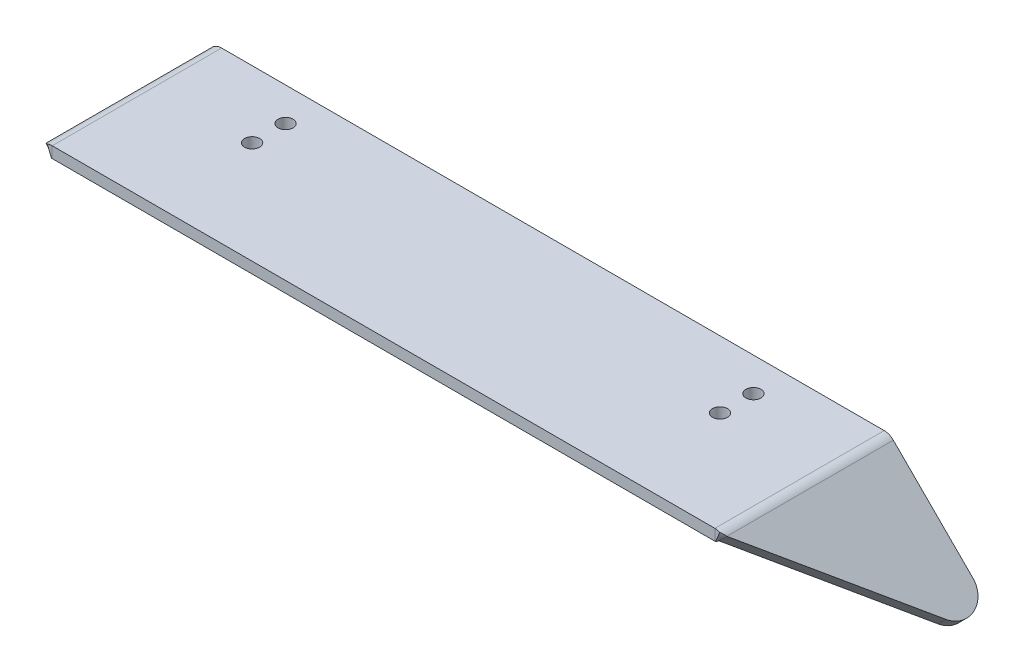
ISO-10303-21;
HEADER;
FILE_DESCRIPTION(('STEP AP214'),'2;1');
FILE_NAME('part.step','',(''),(''),'','','');
FILE_SCHEMA(('AUTOMOTIVE_DESIGN { 1 0 10303 214 1 1 1 1 }'));
ENDSEC;
DATA;
#1=APPLICATION_CONTEXT('core data for automotive mechanical design processes');
#2=APPLICATION_PROTOCOL_DEFINITION('international standard','automotive_design',2000,#1);
#3=PRODUCT_CONTEXT('',#1,'mechanical');
#4=PRODUCT('Part','Part','',(#3));
#5=PRODUCT_RELATED_PRODUCT_CATEGORY('part','',(#4));
#6=PRODUCT_DEFINITION_FORMATION('','',#4);
#7=PRODUCT_DEFINITION_CONTEXT('part definition',#1,'design');
#8=PRODUCT_DEFINITION('design','',#6,#7);
#9=PRODUCT_DEFINITION_SHAPE('','',#8);
#10=(LENGTH_UNIT() NAMED_UNIT(*) SI_UNIT(.MILLI.,.METRE.));
#11=(NAMED_UNIT(*) PLANE_ANGLE_UNIT() SI_UNIT($,.RADIAN.));
#12=(NAMED_UNIT(*) SI_UNIT($,.STERADIAN.) SOLID_ANGLE_UNIT());
#13=UNCERTAINTY_MEASURE_WITH_UNIT(LENGTH_MEASURE(1.E-05),#10,'distance_accuracy_value','');
#14=(GEOMETRIC_REPRESENTATION_CONTEXT(3) GLOBAL_UNCERTAINTY_ASSIGNED_CONTEXT((#13)) GLOBAL_UNIT_ASSIGNED_CONTEXT((#10,
#11,#12)) REPRESENTATION_CONTEXT('',''));
#15=CARTESIAN_POINT('',(0.,0.,0.));
#16=DIRECTION('',(0.,0.,1.));
#17=DIRECTION('',(1.,0.,0.));
#18=AXIS2_PLACEMENT_3D('',#15,#16,#17);
#19=CARTESIAN_POINT('',(-128.179743878931,0.,6.35000000000003));
#20=DIRECTION('',(0.,-1.,0.));
#21=DIRECTION('',(0.,0.,-1.));
#22=AXIS2_PLACEMENT_3D('',#19,#20,#21);
#23=PLANE('',#22);
#24=CARTESIAN_POINT('',(-66.6750000000001,0.,9.52499999999995));
#25=DIRECTION('',(0.,-1.,0.));
#26=DIRECTION('',(0.,0.,-1.));
#27=AXIS2_PLACEMENT_3D('',#24,#25,#26);
#28=CIRCLE('',#27,2.15264999999999);
#29=CARTESIAN_POINT('',(-66.6750000000001,0.,7.37234999999996));
#30=VERTEX_POINT('',#29);
#31=EDGE_CURVE('E588',#30,#30,#28,.T.);
#32=ORIENTED_EDGE('',*,*,#31,.F.);
#33=EDGE_LOOP('',(#32));
#34=FACE_BOUND('',#33,.T.);
#35=CARTESIAN_POINT('',(66.6749999999999,0.,9.52499999999997));
#36=DIRECTION('',(0.,-1.,0.));
#37=DIRECTION('',(0.,0.,-1.));
#38=AXIS2_PLACEMENT_3D('',#35,#36,#37);
#39=CIRCLE('',#38,2.15264999999999);
#40=CARTESIAN_POINT('',(66.6749999999999,0.,7.37234999999998));
#41=VERTEX_POINT('',#40);
#42=EDGE_CURVE('E582',#41,#41,#39,.T.);
#43=ORIENTED_EDGE('',*,*,#42,.F.);
#44=EDGE_LOOP('',(#43));
#45=FACE_BOUND('',#44,.T.);
#46=CARTESIAN_POINT('',(66.675,0.,19.05));
#47=DIRECTION('',(0.,-1.,0.));
#48=DIRECTION('',(0.,0.,-1.));
#49=AXIS2_PLACEMENT_3D('',#46,#47,#48);
#50=CIRCLE('',#49,2.15264999999999);
#51=CARTESIAN_POINT('',(66.675,0.,16.89735));
#52=VERTEX_POINT('',#51);
#53=EDGE_CURVE('E65',#52,#52,#50,.T.);
#54=ORIENTED_EDGE('',*,*,#53,.F.);
#55=EDGE_LOOP('',(#54));
#56=FACE_BOUND('',#55,.T.);
#57=CARTESIAN_POINT('',(-66.675,0.,19.05));
#58=DIRECTION('',(0.,-1.,0.));
#59=DIRECTION('',(0.,0.,-1.));
#60=AXIS2_PLACEMENT_3D('',#57,#58,#59);
#61=CIRCLE('',#60,2.15264999999999);
#62=CARTESIAN_POINT('',(-66.675,0.,16.89735));
#63=VERTEX_POINT('',#62);
#64=EDGE_CURVE('E199',#63,#63,#61,.T.);
#65=ORIENTED_EDGE('',*,*,#64,.F.);
#66=EDGE_LOOP('',(#65));
#67=FACE_BOUND('',#66,.T.);
#68=DIRECTION('',(-1.,0.,0.));
#69=VECTOR('',#68,1.);
#70=CARTESIAN_POINT('',(-128.179743878931,0.,0.));
#71=LINE('',#70,#69);
#72=CARTESIAN_POINT('',(94.4302406669538,0.,0.));
#73=VERTEX_POINT('',#72);
#74=CARTESIAN_POINT('',(-94.4302406669539,0.,0.));
#75=VERTEX_POINT('',#74);
#76=EDGE_CURVE('E78',#73,#75,#71,.T.);
#77=ORIENTED_EDGE('',*,*,#76,.F.);
#78=DIRECTION('',(0.,0.,1.));
#79=VECTOR('',#78,1.);
#80=CARTESIAN_POINT('',(94.4302406669539,0.,6.35000000000003));
#81=LINE('',#80,#79);
#82=CARTESIAN_POINT('',(94.4302406669539,0.,48.26));
#83=VERTEX_POINT('',#82);
#84=EDGE_CURVE('E70',#73,#83,#81,.T.);
#85=ORIENTED_EDGE('',*,*,#84,.T.);
#86=DIRECTION('',(1.,0.,0.));
#87=VECTOR('',#86,1.);
#88=CARTESIAN_POINT('',(95.25,0.,48.26));
#89=LINE('',#88,#87);
#90=CARTESIAN_POINT('',(-94.4302406669539,0.,48.26));
#91=VERTEX_POINT('',#90);
#92=EDGE_CURVE('E86',#91,#83,#89,.T.);
#93=ORIENTED_EDGE('',*,*,#92,.F.);
#94=DIRECTION('',(0.,0.,1.));
#95=VECTOR('',#94,1.);
#96=CARTESIAN_POINT('',(-94.4302406669539,0.,6.35000000000003));
#97=LINE('',#96,#95);
#98=EDGE_CURVE('E471',#75,#91,#97,.T.);
#99=ORIENTED_EDGE('',*,*,#98,.F.);
#100=EDGE_LOOP('',(#77,#85,#93,#99));
#101=FACE_BOUND('',#100,.T.);
#102=ADVANCED_FACE('F61',(#34,#45,#56,#67,#101),#23,.T.);
#103=CARTESIAN_POINT('',(-128.179743878931,3.175,6.35000000000003));
#104=DIRECTION('',(0.,-1.,0.));
#105=DIRECTION('',(0.,0.,-1.));
#106=AXIS2_PLACEMENT_3D('',#103,#104,#105);
#107=PLANE('',#106);
#108=CARTESIAN_POINT('',(-66.6750000000001,3.175,9.52499999999995));
#109=DIRECTION('',(0.,1.,0.));
#110=DIRECTION('',(0.,0.,1.));
#111=AXIS2_PLACEMENT_3D('',#108,#109,#110);
#112=CIRCLE('',#111,2.15264999999999);
#113=CARTESIAN_POINT('',(-66.6750000000001,3.175,11.6776499999999));
#114=VERTEX_POINT('',#113);
#115=EDGE_CURVE('E591',#114,#114,#112,.T.);
#116=ORIENTED_EDGE('',*,*,#115,.F.);
#117=EDGE_LOOP('',(#116));
#118=FACE_BOUND('',#117,.T.);
#119=CARTESIAN_POINT('',(66.6749999999999,3.175,9.52499999999997));
#120=DIRECTION('',(0.,1.,0.));
#121=DIRECTION('',(0.,0.,1.));
#122=AXIS2_PLACEMENT_3D('',#119,#120,#121);
#123=CIRCLE('',#122,2.15264999999999);
#124=CARTESIAN_POINT('',(66.6749999999999,3.175,11.67765));
#125=VERTEX_POINT('',#124);
#126=EDGE_CURVE('E585',#125,#125,#123,.T.);
#127=ORIENTED_EDGE('',*,*,#126,.F.);
#128=EDGE_LOOP('',(#127));
#129=FACE_BOUND('',#128,.T.);
#130=CARTESIAN_POINT('',(66.675,3.175,19.05));
#131=DIRECTION('',(0.,1.,0.));
#132=DIRECTION('',(0.,0.,1.));
#133=AXIS2_PLACEMENT_3D('',#130,#131,#132);
#134=CIRCLE('',#133,2.15264999999999);
#135=CARTESIAN_POINT('',(66.675,3.175,21.20265));
#136=VERTEX_POINT('',#135);
#137=EDGE_CURVE('E578',#136,#136,#134,.T.);
#138=ORIENTED_EDGE('',*,*,#137,.F.);
#139=EDGE_LOOP('',(#138));
#140=FACE_BOUND('',#139,.T.);
#141=CARTESIAN_POINT('',(-66.675,3.175,19.05));
#142=DIRECTION('',(0.,1.,0.));
#143=DIRECTION('',(0.,0.,1.));
#144=AXIS2_PLACEMENT_3D('',#141,#142,#143);
#145=CIRCLE('',#144,2.15264999999999);
#146=CARTESIAN_POINT('',(-66.675,3.175,21.2026499999999));
#147=VERTEX_POINT('',#146);
#148=EDGE_CURVE('E571',#147,#147,#145,.T.);
#149=ORIENTED_EDGE('',*,*,#148,.F.);
#150=EDGE_LOOP('',(#149));
#151=FACE_BOUND('',#150,.T.);
#152=DIRECTION('',(0.,0.,1.));
#153=VECTOR('',#152,1.);
#154=CARTESIAN_POINT('',(94.4302406669539,3.175,6.35000000000003));
#155=LINE('',#154,#153);
#156=CARTESIAN_POINT('',(94.4302406669539,3.175,0.));
#157=VERTEX_POINT('',#156);
#158=CARTESIAN_POINT('',(94.4302406669539,3.175,48.26));
#159=VERTEX_POINT('',#158);
#160=EDGE_CURVE('E333',#157,#159,#155,.T.);
#161=ORIENTED_EDGE('',*,*,#160,.F.);
#162=DIRECTION('',(-1.,0.,0.));
#163=VECTOR('',#162,1.);
#164=CARTESIAN_POINT('',(128.179743878931,3.175,0.));
#165=LINE('',#164,#163);
#166=CARTESIAN_POINT('',(-94.4302406669538,3.175,0.));
#167=VERTEX_POINT('',#166);
#168=EDGE_CURVE('E350',#157,#167,#165,.T.);
#169=ORIENTED_EDGE('',*,*,#168,.T.);
#170=DIRECTION('',(0.,0.,1.));
#171=VECTOR('',#170,1.);
#172=CARTESIAN_POINT('',(-94.4302406669539,3.175,6.35000000000003));
#173=LINE('',#172,#171);
#174=CARTESIAN_POINT('',(-94.4302406669539,3.175,48.26));
#175=VERTEX_POINT('',#174);
#176=EDGE_CURVE('E354',#167,#175,#173,.T.);
#177=ORIENTED_EDGE('',*,*,#176,.T.);
#178=DIRECTION('',(1.,0.,0.));
#179=VECTOR('',#178,1.);
#180=CARTESIAN_POINT('',(95.25,3.175,48.26));
#181=LINE('',#180,#179);
#182=EDGE_CURVE('E348',#175,#159,#181,.T.);
#183=ORIENTED_EDGE('',*,*,#182,.T.);
#184=EDGE_LOOP('',(#161,#169,#177,#183));
#185=FACE_BOUND('',#184,.T.);
#186=ADVANCED_FACE('F387',(#118,#129,#140,#151,#185),#107,.F.);
#187=CARTESIAN_POINT('',(-128.179743878931,3.175,0.));
#188=DIRECTION('',(0.,0.,1.));
#189=DIRECTION('',(1.,0.,0.));
#190=AXIS2_PLACEMENT_3D('',#187,#188,#189);
#191=PLANE('',#190);
#192=DIRECTION('',(0.,1.,0.));
#193=VECTOR('',#192,1.);
#194=CARTESIAN_POINT('',(94.4302406669539,3.175,0.));
#195=LINE('',#194,#193);
#196=EDGE_CURVE('E12',#73,#157,#195,.T.);
#197=ORIENTED_EDGE('',*,*,#196,.F.);
#198=ORIENTED_EDGE('',*,*,#76,.T.);
#199=DIRECTION('',(0.,1.,0.));
#200=VECTOR('',#199,1.);
#201=CARTESIAN_POINT('',(-94.4302406669539,3.175,0.));
#202=LINE('',#201,#200);
#203=EDGE_CURVE('E468',#75,#167,#202,.T.);
#204=ORIENTED_EDGE('',*,*,#203,.T.);
#205=ORIENTED_EDGE('',*,*,#168,.F.);
#206=EDGE_LOOP('',(#197,#198,#204,#205));
#207=FACE_BOUND('',#206,.T.);
#208=ADVANCED_FACE('F63',(#207),#191,.F.);
#209=CARTESIAN_POINT('',(95.25,3.175,48.26));
#210=DIRECTION('',(0.,0.,-1.));
#211=DIRECTION('',(-1.,0.,0.));
#212=AXIS2_PLACEMENT_3D('',#209,#210,#211);
#213=PLANE('',#212);
#214=DIRECTION('',(0.,-1.,0.));
#215=VECTOR('',#214,1.);
#216=CARTESIAN_POINT('',(94.4302406669539,3.175,48.26));
#217=LINE('',#216,#215);
#218=EDGE_CURVE('E341',#159,#83,#217,.T.);
#219=ORIENTED_EDGE('',*,*,#218,.F.);
#220=ORIENTED_EDGE('',*,*,#182,.F.);
#221=DIRECTION('',(0.,-1.,0.));
#222=VECTOR('',#221,1.);
#223=CARTESIAN_POINT('',(-94.4302406669539,3.175,48.26));
#224=LINE('',#223,#222);
#225=EDGE_CURVE('E342',#175,#91,#224,.T.);
#226=ORIENTED_EDGE('',*,*,#225,.T.);
#227=ORIENTED_EDGE('',*,*,#92,.T.);
#228=EDGE_LOOP('',(#219,#220,#226,#227));
#229=FACE_BOUND('',#228,.T.);
#230=ADVANCED_FACE('F397',(#229),#213,.F.);
#231=CARTESIAN_POINT('',(-94.4302406669539,-0.5,0.));
#232=DIRECTION('',(0.,0.,-1.));
#233=DIRECTION('',(-1.,0.,0.));
#234=AXIS2_PLACEMENT_3D('',#231,#232,#233);
#235=PLANE('',#234);
#236=ORIENTED_EDGE('',*,*,#203,.F.);
#237=CARTESIAN_POINT('',(-94.4302406669539,-0.5,0.));
#238=DIRECTION('',(0.,0.,1.));
#239=DIRECTION('',(1.,0.,0.));
#240=AXIS2_PLACEMENT_3D('',#237,#238,#239);
#241=CIRCLE('',#240,0.5);
#242=CARTESIAN_POINT('',(-94.7837940575472,-0.146446609406742,0.));
#243=VERTEX_POINT('',#242);
#244=EDGE_CURVE('E488',#75,#243,#241,.T.);
#245=ORIENTED_EDGE('',*,*,#244,.T.);
#246=DIRECTION('',(-0.707106781186549,0.707106781186546,0.));
#247=VECTOR('',#246,1.);
#248=CARTESIAN_POINT('',(-97.0288580878145,2.09861742086055,0.));
#249=LINE('',#248,#247);
#250=CARTESIAN_POINT('',(-97.0288580878145,2.09861742086059,0.));
#251=VERTEX_POINT('',#250);
#252=EDGE_CURVE('E512',#243,#251,#249,.T.);
#253=ORIENTED_EDGE('',*,*,#252,.T.);
#254=CARTESIAN_POINT('',(-94.4302406669539,-0.5,0.));
#255=DIRECTION('',(0.,0.,1.));
#256=DIRECTION('',(1.,0.,0.));
#257=AXIS2_PLACEMENT_3D('',#254,#255,#256);
#258=CIRCLE('',#257,3.675);
#259=EDGE_CURVE('E515',#167,#251,#258,.T.);
#260=ORIENTED_EDGE('',*,*,#259,.F.);
#261=EDGE_LOOP('',(#236,#245,#253,#260));
#262=FACE_BOUND('',#261,.T.);
#263=ADVANCED_FACE('F400',(#262),#235,.T.);
#264=CARTESIAN_POINT('',(-97.0288580878145,2.09861742086053,47.4402406669539));
#265=CARTESIAN_POINT('',(-96.688541159747,2.43893434892802,47.7136212660517));
#266=CARTESIAN_POINT('',(-96.2812477754291,2.71107908769511,47.9866194009022));
#267=CARTESIAN_POINT('',(-95.8366022808956,2.89525728197897,48.26));
#268=CARTESIAN_POINT('',(-94.7837940575472,-0.146446609406729,47.4402406669539));
#269=CARTESIAN_POINT('',(-94.737512230733,-0.100164782592577,47.7135043833969));
#270=CARTESIAN_POINT('',(-94.6820525039986,-0.0631077779238174,47.986736283557));
#271=CARTESIAN_POINT('',(-94.6215823831365,-0.0380602337443571,48.26));
#272=B_SPLINE_SURFACE_WITH_KNOTS('',1,3,((#264,#265,#266,#267),(#268,#269,#270,#271)),
.UNSPECIFIED.,.F.,.F.,.F.,(2,2),(4,4),(0.,1.),(0.,1.),.UNSPECIFIED.);
#273=CARTESIAN_POINT('',(-97.0288580878145,2.09861742086053,47.4402406669539));
#274=CARTESIAN_POINT('',(-94.7837940575472,-0.146446609406729,47.4402406669539));
#275=B_SPLINE_CURVE_WITH_KNOTS('',1,(#273,#274),.UNSPECIFIED.,.F.,.F.,(2,2),(0.,1.),.UNSPECIFIED.);
#276=CARTESIAN_POINT('',(-97.0288580878145,2.09861742086054,47.4402406669539));
#277=VERTEX_POINT('',#276);
#278=CARTESIAN_POINT('',(-94.7837940575472,-0.146446609406728,47.4402406669539));
#279=VERTEX_POINT('',#278);
#280=EDGE_CURVE('E456',#277,#279,#275,.T.);
#281=CARTESIAN_POINT('',(-94.7837940575472,-0.146446609406729,47.4402406669539));
#282=CARTESIAN_POINT('',(-94.737512230733,-0.100164782592577,47.7135043833969));
#283=CARTESIAN_POINT('',(-94.6820525039986,-0.0631077779238174,47.986736283557));
#284=CARTESIAN_POINT('',(-94.6215823831365,-0.0380602337443571,48.26));
#285=B_SPLINE_CURVE_WITH_KNOTS('',3,(#281,#282,#283,#284),.UNSPECIFIED.,.F.,.F.,(4,4),(0.,1.),.UNSPECIFIED.);
#286=CARTESIAN_POINT('',(-94.6215823831365,-0.0380602337443578,48.26));
#287=VERTEX_POINT('',#286);
#288=EDGE_CURVE('E522',#279,#287,#285,.T.);
#289=CARTESIAN_POINT('',(-94.6215823831365,-0.0380602337443571,48.26));
#290=CARTESIAN_POINT('',(-95.8366022808956,2.89525728197897,48.26));
#291=B_SPLINE_CURVE_WITH_KNOTS('',1,(#289,#290),.UNSPECIFIED.,.F.,.F.,(2,2),(0.,1.),.UNSPECIFIED.);
#292=CARTESIAN_POINT('',(-95.8366022808956,2.89525728197897,48.26));
#293=VERTEX_POINT('',#292);
#294=EDGE_CURVE('E347',#287,#293,#291,.T.);
#295=CARTESIAN_POINT('',(-95.8366022808956,2.89525728197897,48.26));
#296=CARTESIAN_POINT('',(-96.2812477754291,2.71107908769511,47.9866194009022));
#297=CARTESIAN_POINT('',(-96.688541159747,2.43893434892802,47.7136212660517));
#298=CARTESIAN_POINT('',(-97.0288580878145,2.09861742086053,47.4402406669539));
#299=B_SPLINE_CURVE_WITH_KNOTS('',3,(#295,#296,#297,#298),.UNSPECIFIED.,.F.,.F.,(4,4),(0.,1.),.UNSPECIFIED.);
#300=EDGE_CURVE('E518',#277,#293,#299,.F.);
#301=ORIENTED_EDGE('',*,*,#280,.T.);
#302=ORIENTED_EDGE('',*,*,#288,.T.);
#303=ORIENTED_EDGE('',*,*,#294,.T.);
#304=ORIENTED_EDGE('',*,*,#300,.F.);
#305=EDGE_LOOP('',(#301,#302,#303,#304));
#306=FACE_BOUND('',#305,.T.);
#307=ADVANCED_FACE('F403',(#306),#272,.T.);
#308=CARTESIAN_POINT('',(-94.4302406669539,-0.5,48.26));
#309=DIRECTION('',(0.,0.,1.));
#310=DIRECTION('',(1.,0.,0.));
#311=AXIS2_PLACEMENT_3D('',#308,#309,#310);
#312=PLANE('',#311);
#313=ORIENTED_EDGE('',*,*,#294,.F.);
#314=CARTESIAN_POINT('',(-94.4302406669539,-0.5,48.26));
#315=DIRECTION('',(0.,0.,1.));
#316=DIRECTION('',(1.,0.,0.));
#317=AXIS2_PLACEMENT_3D('',#314,#315,#316);
#318=CIRCLE('',#317,0.5);
#319=EDGE_CURVE('E519',#287,#91,#318,.F.);
#320=ORIENTED_EDGE('',*,*,#319,.T.);
#321=ORIENTED_EDGE('',*,*,#225,.F.);
#322=CARTESIAN_POINT('',(-94.4302406669539,-0.5,48.26));
#323=DIRECTION('',(0.,0.,-1.));
#324=DIRECTION('',(-1.,0.,0.));
#325=AXIS2_PLACEMENT_3D('',#322,#323,#324);
#326=CIRCLE('',#325,3.675);
#327=EDGE_CURVE('E529',#293,#175,#326,.T.);
#328=ORIENTED_EDGE('',*,*,#327,.F.);
#329=EDGE_LOOP('',(#313,#320,#321,#328));
#330=FACE_BOUND('',#329,.T.);
#331=ADVANCED_FACE('F410',(#330),#312,.T.);
#332=CARTESIAN_POINT('',(-94.4302406669539,-0.5,-24.2621093408467));
#333=DIRECTION('',(0.,0.,1.));
#334=DIRECTION('',(1.,0.,0.));
#335=AXIS2_PLACEMENT_3D('',#332,#333,#334);
#336=CYLINDRICAL_SURFACE('',#335,3.675);
#337=ORIENTED_EDGE('',*,*,#327,.T.);
#338=ORIENTED_EDGE('',*,*,#176,.F.);
#339=ORIENTED_EDGE('',*,*,#259,.T.);
#340=DIRECTION('',(0.,0.,1.));
#341=VECTOR('',#340,1.);
#342=CARTESIAN_POINT('',(-97.0288580878145,2.09861742086055,6.35000000000003));
#343=LINE('',#342,#341);
#344=EDGE_CURVE('E481',#251,#277,#343,.T.);
#345=ORIENTED_EDGE('',*,*,#344,.T.);
#346=ORIENTED_EDGE('',*,*,#300,.T.);
#347=EDGE_LOOP('',(#337,#338,#339,#345,#346));
#348=FACE_BOUND('',#347,.T.);
#349=ADVANCED_FACE('F324',(#348),#336,.T.);
#350=CARTESIAN_POINT('',(-94.4302406669539,-0.5,-24.2621093408467));
#351=DIRECTION('',(0.,0.,1.));
#352=DIRECTION('',(1.,0.,0.));
#353=AXIS2_PLACEMENT_3D('',#350,#351,#352);
#354=CYLINDRICAL_SURFACE('',#353,0.5);
#355=ORIENTED_EDGE('',*,*,#319,.F.);
#356=ORIENTED_EDGE('',*,*,#288,.F.);
#357=DIRECTION('',(0.,0.,1.));
#358=VECTOR('',#357,1.);
#359=CARTESIAN_POINT('',(-94.7837940575472,-0.146446609406728,6.35000000000003));
#360=LINE('',#359,#358);
#361=EDGE_CURVE('E492',#243,#279,#360,.T.);
#362=ORIENTED_EDGE('',*,*,#361,.F.);
#363=ORIENTED_EDGE('',*,*,#244,.F.);
#364=ORIENTED_EDGE('',*,*,#98,.T.);
#365=EDGE_LOOP('',(#355,#356,#362,#363,#364));
#366=FACE_BOUND('',#365,.T.);
#367=ADVANCED_FACE('F307',(#366),#354,.F.);
#368=CARTESIAN_POINT('',(-119.734045904005,-20.6065703953297,6.35000000000003));
#369=DIRECTION('',(0.707106781186549,-0.707106781186546,0.));
#370=DIRECTION('',(0.,0.,-1.));
#371=AXIS2_PLACEMENT_3D('',#368,#369,#370);
#372=CYLINDRICAL_SURFACE('',#371,6.35000000000003);
#373=CARTESIAN_POINT('',(-117.488981873737,-22.851634425597,6.35000000000003));
#374=DIRECTION('',(-0.707106781186549,0.707106781186546,0.));
#375=DIRECTION('',(0.,0.,-1.));
#376=AXIS2_PLACEMENT_3D('',#373,#374,#375);
#377=CIRCLE('',#376,6.35000000000003);
#378=CARTESIAN_POINT('',(-117.488981873737,-22.851634425597,0.));
#379=VERTEX_POINT('',#378);
#380=CARTESIAN_POINT('',(-120.663981873737,-26.026634425597,10.8401280605346));
#381=VERTEX_POINT('',#380);
#382=EDGE_CURVE('E510',#379,#381,#377,.T.);
#383=ORIENTED_EDGE('',*,*,#382,.T.);
#384=DIRECTION('',(0.707106781186549,-0.707106781186546,0.));
#385=VECTOR('',#384,1.);
#386=CARTESIAN_POINT('',(-122.909045904005,-23.7815703953297,10.8401280605346));
#387=LINE('',#386,#385);
#388=CARTESIAN_POINT('',(-122.909045904005,-23.7815703953297,10.8401280605346));
#389=VERTEX_POINT('',#388);
#390=EDGE_CURVE('E489',#389,#381,#387,.T.);
#391=ORIENTED_EDGE('',*,*,#390,.F.);
#392=CARTESIAN_POINT('',(-119.734045904005,-20.6065703953297,6.35000000000003));
#393=DIRECTION('',(-0.707106781186549,0.707106781186546,0.));
#394=DIRECTION('',(0.,0.,-1.));
#395=AXIS2_PLACEMENT_3D('',#392,#393,#394);
#396=CIRCLE('',#395,6.35000000000003);
#397=CARTESIAN_POINT('',(-119.734045904005,-20.6065703953297,0.));
#398=VERTEX_POINT('',#397);
#399=EDGE_CURVE('E478',#398,#389,#396,.T.);
#400=ORIENTED_EDGE('',*,*,#399,.F.);
#401=DIRECTION('',(0.707106781186549,-0.707106781186546,0.));
#402=VECTOR('',#401,1.);
#403=CARTESIAN_POINT('',(-119.734045904005,-20.6065703953297,0.));
#404=LINE('',#403,#402);
#405=EDGE_CURVE('E508',#398,#379,#404,.T.);
#406=ORIENTED_EDGE('',*,*,#405,.T.);
#407=EDGE_LOOP('',(#383,#391,#400,#406));
#408=FACE_BOUND('',#407,.T.);
#409=ADVANCED_FACE('F303',(#408),#372,.T.);
#410=CARTESIAN_POINT('',(-119.734045904005,-20.6065703953297,6.35000000000003));
#411=DIRECTION('',(0.707106781186549,-0.707106781186546,0.));
#412=DIRECTION('',(0.,0.,-1.));
#413=AXIS2_PLACEMENT_3D('',#410,#411,#412);
#414=PLANE('',#413);
#415=ORIENTED_EDGE('',*,*,#344,.F.);
#416=DIRECTION('',(-0.707106781186546,-0.707106781186549,0.));
#417=VECTOR('',#416,1.);
#418=CARTESIAN_POINT('',(61.5394863110885,160.666961819764,0.));
#419=LINE('',#418,#417);
#420=EDGE_CURVE('E506',#251,#398,#419,.T.);
#421=ORIENTED_EDGE('',*,*,#420,.T.);
#422=ORIENTED_EDGE('',*,*,#399,.T.);
#423=DIRECTION('',(0.499999999999999,0.5,0.707106781186549));
#424=VECTOR('',#423,1.);
#425=CARTESIAN_POINT('',(-96.4492007044766,2.67827480419841,48.26));
#426=LINE('',#425,#424);
#427=EDGE_CURVE('E474',#389,#277,#426,.T.);
#428=ORIENTED_EDGE('',*,*,#427,.T.);
#429=EDGE_LOOP('',(#415,#421,#422,#428));
#430=FACE_BOUND('',#429,.T.);
#431=ADVANCED_FACE('F306',(#430),#414,.F.);
#432=CARTESIAN_POINT('',(-119.734045904005,-20.6065703953297,0.));
#433=DIRECTION('',(0.,0.,1.));
#434=DIRECTION('',(0.707106781186546,0.707106781186549,0.));
#435=AXIS2_PLACEMENT_3D('',#432,#433,#434);
#436=PLANE('',#435);
#437=ORIENTED_EDGE('',*,*,#252,.F.);
#438=DIRECTION('',(-0.707106781186546,-0.707106781186549,0.));
#439=VECTOR('',#438,1.);
#440=CARTESIAN_POINT('',(-117.488981873737,-22.851634425597,0.));
#441=LINE('',#440,#439);
#442=EDGE_CURVE('E477',#243,#379,#441,.T.);
#443=ORIENTED_EDGE('',*,*,#442,.T.);
#444=ORIENTED_EDGE('',*,*,#405,.F.);
#445=ORIENTED_EDGE('',*,*,#420,.F.);
#446=EDGE_LOOP('',(#437,#443,#444,#445));
#447=FACE_BOUND('',#446,.T.);
#448=ADVANCED_FACE('F311',(#447),#436,.F.);
#449=CARTESIAN_POINT('',(-117.488981873737,-22.851634425597,6.35000000000003));
#450=DIRECTION('',(0.707106781186549,-0.707106781186546,0.));
#451=DIRECTION('',(0.,0.,-1.));
#452=AXIS2_PLACEMENT_3D('',#449,#450,#451);
#453=PLANE('',#452);
#454=ORIENTED_EDGE('',*,*,#442,.F.);
#455=ORIENTED_EDGE('',*,*,#361,.T.);
#456=DIRECTION('',(0.499999999999999,0.5,0.707106781186549));
#457=VECTOR('',#456,1.);
#458=CARTESIAN_POINT('',(-94.2041366742094,0.433210773931131,48.26));
#459=LINE('',#458,#457);
#460=EDGE_CURVE('E486',#381,#279,#459,.T.);
#461=ORIENTED_EDGE('',*,*,#460,.F.);
#462=ORIENTED_EDGE('',*,*,#382,.F.);
#463=EDGE_LOOP('',(#454,#455,#461,#462));
#464=FACE_BOUND('',#463,.T.);
#465=ADVANCED_FACE('F315',(#464),#453,.T.);
#466=CARTESIAN_POINT('',(-96.4492007044766,2.67827480419841,48.26));
#467=DIRECTION('',(0.5,0.500000000000002,-0.707106781186546));
#468=DIRECTION('',(-0.499999999999998,-0.5,-0.707106781186549));
#469=AXIS2_PLACEMENT_3D('',#466,#467,#468);
#470=PLANE('',#469);
#471=ORIENTED_EDGE('',*,*,#280,.F.);
#472=ORIENTED_EDGE('',*,*,#427,.F.);
#473=ORIENTED_EDGE('',*,*,#390,.T.);
#474=ORIENTED_EDGE('',*,*,#460,.T.);
#475=EDGE_LOOP('',(#471,#472,#473,#474));
#476=FACE_BOUND('',#475,.T.);
#477=ADVANCED_FACE('F301',(#476),#470,.F.);
#478=CARTESIAN_POINT('',(94.4302406669539,-0.5,0.));
#479=DIRECTION('',(0.,0.,-1.));
#480=DIRECTION('',(-1.,0.,0.));
#481=AXIS2_PLACEMENT_3D('',#478,#479,#480);
#482=PLANE('',#481);
#483=DIRECTION('',(0.707106781186549,0.707106781186546,0.));
#484=VECTOR('',#483,1.);
#485=CARTESIAN_POINT('',(97.0288580878145,2.09861742086057,0.));
#486=LINE('',#485,#484);
#487=CARTESIAN_POINT('',(94.7837940575472,-0.146446609406672,0.));
#488=VERTEX_POINT('',#487);
#489=CARTESIAN_POINT('',(97.0288580878145,2.09861742086055,0.));
#490=VERTEX_POINT('',#489);
#491=EDGE_CURVE('E177',#488,#490,#486,.T.);
#492=ORIENTED_EDGE('',*,*,#491,.F.);
#493=CARTESIAN_POINT('',(94.4302406669539,-0.5,0.));
#494=DIRECTION('',(0.,0.,-1.));
#495=DIRECTION('',(-1.,0.,0.));
#496=AXIS2_PLACEMENT_3D('',#493,#494,#495);
#497=CIRCLE('',#496,0.5);
#498=EDGE_CURVE('E192',#488,#73,#497,.F.);
#499=ORIENTED_EDGE('',*,*,#498,.T.);
#500=ORIENTED_EDGE('',*,*,#196,.T.);
#501=CARTESIAN_POINT('',(94.4302406669539,-0.5,0.));
#502=DIRECTION('',(0.,0.,1.));
#503=DIRECTION('',(1.,0.,0.));
#504=AXIS2_PLACEMENT_3D('',#501,#502,#503);
#505=CIRCLE('',#504,3.675);
#506=EDGE_CURVE('E209',#490,#157,#505,.T.);
#507=ORIENTED_EDGE('',*,*,#506,.F.);
#508=EDGE_LOOP('',(#492,#499,#500,#507));
#509=FACE_BOUND('',#508,.T.);
#510=ADVANCED_FACE('F298',(#509),#482,.T.);
#511=CARTESIAN_POINT('',(94.4302406669539,-0.5,48.26));
#512=DIRECTION('',(0.,0.,1.));
#513=DIRECTION('',(1.,0.,0.));
#514=AXIS2_PLACEMENT_3D('',#511,#512,#513);
#515=PLANE('',#514);
#516=ORIENTED_EDGE('',*,*,#218,.T.);
#517=CARTESIAN_POINT('',(94.4302406669539,-0.5,48.26));
#518=DIRECTION('',(0.,0.,-1.));
#519=DIRECTION('',(-1.,0.,0.));
#520=AXIS2_PLACEMENT_3D('',#517,#518,#519);
#521=CIRCLE('',#520,0.5);
#522=CARTESIAN_POINT('',(94.6215823831365,-0.038060233744357,48.26));
#523=VERTEX_POINT('',#522);
#524=EDGE_CURVE('E195',#83,#523,#521,.T.);
#525=ORIENTED_EDGE('',*,*,#524,.T.);
#526=CARTESIAN_POINT('',(95.8366022808956,2.89525728197897,48.26));
#527=CARTESIAN_POINT('',(94.6215823831365,-0.0380602337443571,48.26));
#528=B_SPLINE_CURVE_WITH_KNOTS('',1,(#526,#527),.UNSPECIFIED.,.F.,.F.,(2,2),(0.,1.),.UNSPECIFIED.);
#529=CARTESIAN_POINT('',(95.8366022808956,2.89525728197898,48.26));
#530=VERTEX_POINT('',#529);
#531=EDGE_CURVE('E283',#523,#530,#528,.F.);
#532=ORIENTED_EDGE('',*,*,#531,.T.);
#533=CARTESIAN_POINT('',(94.4302406669539,-0.5,48.26));
#534=DIRECTION('',(0.,0.,-1.));
#535=DIRECTION('',(-1.,0.,0.));
#536=AXIS2_PLACEMENT_3D('',#533,#534,#535);
#537=CIRCLE('',#536,3.675);
#538=EDGE_CURVE('E212',#159,#530,#537,.T.);
#539=ORIENTED_EDGE('',*,*,#538,.F.);
#540=EDGE_LOOP('',(#516,#525,#532,#539));
#541=FACE_BOUND('',#540,.T.);
#542=ADVANCED_FACE('F289',(#541),#515,.T.);
#543=CARTESIAN_POINT('',(95.8366022808956,2.89525728197897,48.26));
#544=CARTESIAN_POINT('',(96.2812477754292,2.71107908769507,47.9866194009021));
#545=CARTESIAN_POINT('',(96.6885411597469,2.4389343489281,47.7136212660518));
#546=CARTESIAN_POINT('',(97.0288580878145,2.09861742086056,47.4402406669539));
#547=CARTESIAN_POINT('',(94.6215823831365,-0.0380602337443571,48.26));
#548=CARTESIAN_POINT('',(94.6820525039986,-0.0631077779238157,47.986736283557));
#549=CARTESIAN_POINT('',(94.737512230733,-0.10016478259258,47.7135043833969));
#550=CARTESIAN_POINT('',(94.7837940575472,-0.146446609406727,47.4402406669539));
#551=B_SPLINE_SURFACE_WITH_KNOTS('',1,3,((#543,#544,#545,#546),(#547,#548,#549,#550)),
.UNSPECIFIED.,.F.,.F.,.F.,(2,2),(4,4),(0.,1.),(0.,1.),.UNSPECIFIED.);
#552=CARTESIAN_POINT('',(94.6215823831365,-0.0380602337443571,48.26));
#553=CARTESIAN_POINT('',(94.6820525039986,-0.0631077779238157,47.986736283557));
#554=CARTESIAN_POINT('',(94.737512230733,-0.10016478259258,47.7135043833969));
#555=CARTESIAN_POINT('',(94.7837940575472,-0.146446609406727,47.4402406669539));
#556=B_SPLINE_CURVE_WITH_KNOTS('',3,(#552,#553,#554,#555),.UNSPECIFIED.,.F.,.F.,(4,4),(0.,1.),.UNSPECIFIED.);
#557=CARTESIAN_POINT('',(94.7837940575472,-0.146446609406714,47.4402406669539));
#558=VERTEX_POINT('',#557);
#559=EDGE_CURVE('E213',#523,#558,#556,.T.);
#560=CARTESIAN_POINT('',(94.7837940575472,-0.146446609406727,47.4402406669539));
#561=CARTESIAN_POINT('',(97.0288580878145,2.09861742086056,47.4402406669539));
#562=B_SPLINE_CURVE_WITH_KNOTS('',1,(#560,#561),.UNSPECIFIED.,.F.,.F.,(2,2),(0.,1.),.UNSPECIFIED.);
#563=CARTESIAN_POINT('',(97.0288580878145,2.09861742086056,47.4402406669539));
#564=VERTEX_POINT('',#563);
#565=EDGE_CURVE('E204',#564,#558,#562,.F.);
#566=CARTESIAN_POINT('',(97.0288580878145,2.09861742086056,47.4402406669539));
#567=CARTESIAN_POINT('',(96.6885411597469,2.4389343489281,47.7136212660518));
#568=CARTESIAN_POINT('',(96.2812477754292,2.71107908769507,47.9866194009021));
#569=CARTESIAN_POINT('',(95.8366022808956,2.89525728197897,48.26));
#570=B_SPLINE_CURVE_WITH_KNOTS('',3,(#566,#567,#568,#569),.UNSPECIFIED.,.F.,.F.,(4,4),(0.,1.),.UNSPECIFIED.);
#571=EDGE_CURVE('E261',#530,#564,#570,.F.);
#572=ORIENTED_EDGE('',*,*,#531,.F.);
#573=ORIENTED_EDGE('',*,*,#559,.T.);
#574=ORIENTED_EDGE('',*,*,#565,.F.);
#575=ORIENTED_EDGE('',*,*,#571,.F.);
#576=EDGE_LOOP('',(#572,#573,#574,#575));
#577=FACE_BOUND('',#576,.T.);
#578=ADVANCED_FACE('F229',(#577),#551,.T.);
#579=CARTESIAN_POINT('',(94.4302406669539,-0.5,72.5221093408467));
#580=DIRECTION('',(0.,0.,-1.));
#581=DIRECTION('',(-1.,0.,0.));
#582=AXIS2_PLACEMENT_3D('',#579,#580,#581);
#583=CYLINDRICAL_SURFACE('',#582,3.675);
#584=ORIENTED_EDGE('',*,*,#571,.T.);
#585=DIRECTION('',(0.,0.,1.));
#586=VECTOR('',#585,1.);
#587=CARTESIAN_POINT('',(97.0288580878145,2.09861742086057,6.35000000000003));
#588=LINE('',#587,#586);
#589=EDGE_CURVE('E207',#490,#564,#588,.T.);
#590=ORIENTED_EDGE('',*,*,#589,.F.);
#591=ORIENTED_EDGE('',*,*,#506,.T.);
#592=ORIENTED_EDGE('',*,*,#160,.T.);
#593=ORIENTED_EDGE('',*,*,#538,.T.);
#594=EDGE_LOOP('',(#584,#590,#591,#592,#593));
#595=FACE_BOUND('',#594,.T.);
#596=ADVANCED_FACE('F218',(#595),#583,.T.);
#597=CARTESIAN_POINT('',(94.4302406669539,-0.5,72.5221093408467));
#598=DIRECTION('',(0.,0.,-1.));
#599=DIRECTION('',(-1.,0.,0.));
#600=AXIS2_PLACEMENT_3D('',#597,#598,#599);
#601=CYLINDRICAL_SURFACE('',#600,0.5);
#602=ORIENTED_EDGE('',*,*,#559,.F.);
#603=ORIENTED_EDGE('',*,*,#524,.F.);
#604=ORIENTED_EDGE('',*,*,#84,.F.);
#605=ORIENTED_EDGE('',*,*,#498,.F.);
#606=DIRECTION('',(0.,0.,1.));
#607=VECTOR('',#606,1.);
#608=CARTESIAN_POINT('',(94.7837940575472,-0.146446609406714,6.35000000000003));
#609=LINE('',#608,#607);
#610=EDGE_CURVE('E172',#488,#558,#609,.T.);
#611=ORIENTED_EDGE('',*,*,#610,.T.);
#612=EDGE_LOOP('',(#602,#603,#604,#605,#611));
#613=FACE_BOUND('',#612,.T.);
#614=ADVANCED_FACE('F228',(#613),#601,.F.);
#615=CARTESIAN_POINT('',(119.734045904005,-20.6065703953297,6.35));
#616=DIRECTION('',(-0.707106781186549,-0.707106781186546,0.));
#617=DIRECTION('',(0.,0.,-1.));
#618=AXIS2_PLACEMENT_3D('',#615,#616,#617);
#619=CYLINDRICAL_SURFACE('',#618,6.35000000000003);
#620=CARTESIAN_POINT('',(117.488981873737,-22.851634425597,6.35));
#621=DIRECTION('',(0.707106781186549,0.707106781186546,0.));
#622=DIRECTION('',(0.,0.,1.));
#623=AXIS2_PLACEMENT_3D('',#620,#621,#622);
#624=CIRCLE('',#623,6.35000000000003);
#625=CARTESIAN_POINT('',(120.663981873737,-26.026634425597,10.8401280605346));
#626=VERTEX_POINT('',#625);
#627=CARTESIAN_POINT('',(117.488981873737,-22.851634425597,0.));
#628=VERTEX_POINT('',#627);
#629=EDGE_CURVE('E170',#626,#628,#624,.T.);
#630=ORIENTED_EDGE('',*,*,#629,.T.);
#631=DIRECTION('',(-0.707106781186549,-0.707106781186546,0.));
#632=VECTOR('',#631,1.);
#633=CARTESIAN_POINT('',(119.734045904005,-20.6065703953297,0.));
#634=LINE('',#633,#632);
#635=CARTESIAN_POINT('',(119.734045904005,-20.6065703953297,0.));
#636=VERTEX_POINT('',#635);
#637=EDGE_CURVE('E185',#636,#628,#634,.T.);
#638=ORIENTED_EDGE('',*,*,#637,.F.);
#639=CARTESIAN_POINT('',(119.734045904005,-20.6065703953297,6.35));
#640=DIRECTION('',(0.707106781186549,0.707106781186546,0.));
#641=DIRECTION('',(0.,0.,1.));
#642=AXIS2_PLACEMENT_3D('',#639,#640,#641);
#643=CIRCLE('',#642,6.35000000000003);
#644=CARTESIAN_POINT('',(122.909045904005,-23.7815703953297,10.8401280605346));
#645=VERTEX_POINT('',#644);
#646=EDGE_CURVE('E202',#645,#636,#643,.T.);
#647=ORIENTED_EDGE('',*,*,#646,.F.);
#648=DIRECTION('',(-0.707106781186549,-0.707106781186546,0.));
#649=VECTOR('',#648,1.);
#650=CARTESIAN_POINT('',(122.909045904005,-23.7815703953297,10.8401280605346));
#651=LINE('',#650,#649);
#652=EDGE_CURVE('E188',#645,#626,#651,.T.);
#653=ORIENTED_EDGE('',*,*,#652,.T.);
#654=EDGE_LOOP('',(#630,#638,#647,#653));
#655=FACE_BOUND('',#654,.T.);
#656=ADVANCED_FACE('F183',(#655),#619,.T.);
#657=CARTESIAN_POINT('',(-61.5394863110885,160.666961819764,6.35000000000003));
#658=DIRECTION('',(-0.707106781186549,-0.707106781186546,0.));
#659=DIRECTION('',(0.,0.,-1.));
#660=AXIS2_PLACEMENT_3D('',#657,#658,#659);
#661=PLANE('',#660);
#662=DIRECTION('',(-0.707106781186546,0.707106781186549,0.));
#663=VECTOR('',#662,1.);
#664=CARTESIAN_POINT('',(119.734045904005,-20.6065703953297,0.));
#665=LINE('',#664,#663);
#666=EDGE_CURVE('E191',#636,#490,#665,.T.);
#667=ORIENTED_EDGE('',*,*,#666,.T.);
#668=ORIENTED_EDGE('',*,*,#589,.T.);
#669=DIRECTION('',(0.499999999999998,-0.5,-0.707106781186549));
#670=VECTOR('',#669,1.);
#671=CARTESIAN_POINT('',(96.4492007044766,2.67827480419842,48.26));
#672=LINE('',#671,#670);
#673=EDGE_CURVE('E205',#564,#645,#672,.T.);
#674=ORIENTED_EDGE('',*,*,#673,.T.);
#675=ORIENTED_EDGE('',*,*,#646,.T.);
#676=EDGE_LOOP('',(#667,#668,#674,#675));
#677=FACE_BOUND('',#676,.T.);
#678=ADVANCED_FACE('F379',(#677),#661,.F.);
#679=CARTESIAN_POINT('',(96.4492007044766,2.67827480419842,48.26));
#680=DIRECTION('',(-0.5,0.500000000000002,-0.707106781186546));
#681=DIRECTION('',(-0.499999999999998,0.5,0.707106781186549));
#682=AXIS2_PLACEMENT_3D('',#679,#680,#681);
#683=PLANE('',#682);
#684=ORIENTED_EDGE('',*,*,#673,.F.);
#685=ORIENTED_EDGE('',*,*,#565,.T.);
#686=DIRECTION('',(0.499999999999998,-0.5,-0.707106781186549));
#687=VECTOR('',#686,1.);
#688=CARTESIAN_POINT('',(94.2041366742094,0.433210773931145,48.26));
#689=LINE('',#688,#687);
#690=EDGE_CURVE('E178',#558,#626,#689,.T.);
#691=ORIENTED_EDGE('',*,*,#690,.T.);
#692=ORIENTED_EDGE('',*,*,#652,.F.);
#693=EDGE_LOOP('',(#684,#685,#691,#692));
#694=FACE_BOUND('',#693,.T.);
#695=ADVANCED_FACE('F370',(#694),#683,.F.);
#696=CARTESIAN_POINT('',(-63.7845503413558,158.421897789497,6.35000000000003));
#697=DIRECTION('',(-0.707106781186549,-0.707106781186546,0.));
#698=DIRECTION('',(0.,0.,-1.));
#699=AXIS2_PLACEMENT_3D('',#696,#697,#698);
#700=PLANE('',#699);
#701=ORIENTED_EDGE('',*,*,#610,.F.);
#702=DIRECTION('',(-0.707106781186546,0.707106781186549,0.));
#703=VECTOR('',#702,1.);
#704=CARTESIAN_POINT('',(-63.7845503413558,158.421897789497,0.));
#705=LINE('',#704,#703);
#706=EDGE_CURVE('E167',#628,#488,#705,.T.);
#707=ORIENTED_EDGE('',*,*,#706,.F.);
#708=ORIENTED_EDGE('',*,*,#629,.F.);
#709=ORIENTED_EDGE('',*,*,#690,.F.);
#710=EDGE_LOOP('',(#701,#707,#708,#709));
#711=FACE_BOUND('',#710,.T.);
#712=ADVANCED_FACE('F169',(#711),#700,.T.);
#713=CARTESIAN_POINT('',(-61.5394863110885,160.666961819764,0.));
#714=DIRECTION('',(0.,0.,1.));
#715=DIRECTION('',(0.707106781186546,-0.707106781186549,0.));
#716=AXIS2_PLACEMENT_3D('',#713,#714,#715);
#717=PLANE('',#716);
#718=ORIENTED_EDGE('',*,*,#706,.T.);
#719=ORIENTED_EDGE('',*,*,#491,.T.);
#720=ORIENTED_EDGE('',*,*,#666,.F.);
#721=ORIENTED_EDGE('',*,*,#637,.T.);
#722=EDGE_LOOP('',(#718,#719,#720,#721));
#723=FACE_BOUND('',#722,.T.);
#724=ADVANCED_FACE('F190',(#723),#717,.F.);
#725=CARTESIAN_POINT('',(-66.675,3.175,19.05));
#726=DIRECTION('',(0.,1.,0.));
#727=DIRECTION('',(0.,0.,1.));
#728=AXIS2_PLACEMENT_3D('',#725,#726,#727);
#729=CYLINDRICAL_SURFACE('',#728,2.15264999999999);
#730=ORIENTED_EDGE('',*,*,#64,.T.);
#731=EDGE_LOOP('',(#730));
#732=FACE_BOUND('',#731,.T.);
#733=ORIENTED_EDGE('',*,*,#148,.T.);
#734=EDGE_LOOP('',(#733));
#735=FACE_BOUND('',#734,.T.);
#736=ADVANCED_FACE('F385',(#732,#735),#729,.F.);
#737=CARTESIAN_POINT('',(66.675,3.175,19.05));
#738=DIRECTION('',(0.,1.,0.));
#739=DIRECTION('',(0.,0.,1.));
#740=AXIS2_PLACEMENT_3D('',#737,#738,#739);
#741=CYLINDRICAL_SURFACE('',#740,2.15264999999999);
#742=ORIENTED_EDGE('',*,*,#53,.T.);
#743=EDGE_LOOP('',(#742));
#744=FACE_BOUND('',#743,.T.);
#745=ORIENTED_EDGE('',*,*,#137,.T.);
#746=EDGE_LOOP('',(#745));
#747=FACE_BOUND('',#746,.T.);
#748=ADVANCED_FACE('F686',(#744,#747),#741,.F.);
#749=CARTESIAN_POINT('',(66.6749999999999,3.175,9.52499999999997));
#750=DIRECTION('',(0.,1.,0.));
#751=DIRECTION('',(0.,0.,1.));
#752=AXIS2_PLACEMENT_3D('',#749,#750,#751);
#753=CYLINDRICAL_SURFACE('',#752,2.15264999999999);
#754=ORIENTED_EDGE('',*,*,#42,.T.);
#755=EDGE_LOOP('',(#754));
#756=FACE_BOUND('',#755,.T.);
#757=ORIENTED_EDGE('',*,*,#126,.T.);
#758=EDGE_LOOP('',(#757));
#759=FACE_BOUND('',#758,.T.);
#760=ADVANCED_FACE('F695',(#756,#759),#753,.F.);
#761=CARTESIAN_POINT('',(-66.6750000000001,3.175,9.52499999999995));
#762=DIRECTION('',(0.,1.,0.));
#763=DIRECTION('',(0.,0.,1.));
#764=AXIS2_PLACEMENT_3D('',#761,#762,#763);
#765=CYLINDRICAL_SURFACE('',#764,2.15264999999999);
#766=ORIENTED_EDGE('',*,*,#31,.T.);
#767=EDGE_LOOP('',(#766));
#768=FACE_BOUND('',#767,.T.);
#769=ORIENTED_EDGE('',*,*,#115,.T.);
#770=EDGE_LOOP('',(#769));
#771=FACE_BOUND('',#770,.T.);
#772=ADVANCED_FACE('F595',(#768,#771),#765,.F.);
#773=CLOSED_SHELL('',(#102,#186,#208,#230,#263,#307,#331,#349,#367,#409,#431,#448,#465,#477,
#510,#542,#578,#596,#614,#656,#678,#695,#712,#724,#736,#748,#760,#772));
#774=MANIFOLD_SOLID_BREP('B2',#773);
#775=ADVANCED_BREP_SHAPE_REPRESENTATION('',(#18,#774),#14);
#776=SHAPE_DEFINITION_REPRESENTATION(#9,#775);
ENDSEC;
END-ISO-10303-21;
